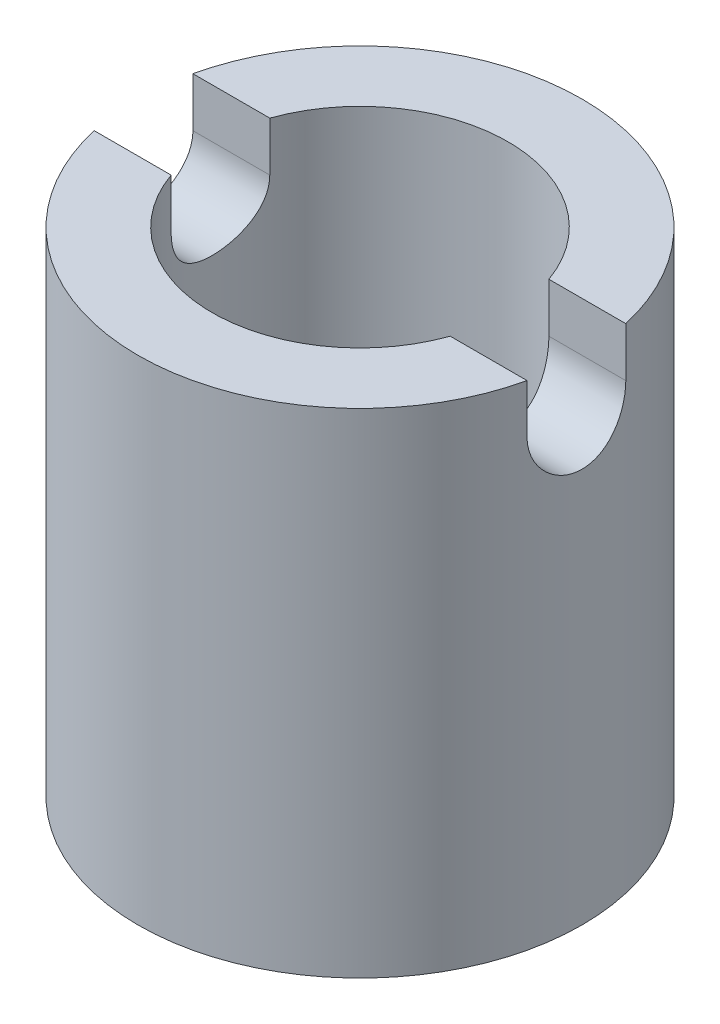
ISO-10303-21;
HEADER;
FILE_DESCRIPTION(('STEP AP214'),'2;1');
FILE_NAME('part.step','',(''),(''),'','','');
FILE_SCHEMA(('AUTOMOTIVE_DESIGN { 1 0 10303 214 1 1 1 1 }'));
ENDSEC;
DATA;
#1=APPLICATION_CONTEXT('core data for automotive mechanical design processes');
#2=APPLICATION_PROTOCOL_DEFINITION('international standard','automotive_design',2000,#1);
#3=PRODUCT_CONTEXT('',#1,'mechanical');
#4=PRODUCT('Part','Part','',(#3));
#5=PRODUCT_RELATED_PRODUCT_CATEGORY('part','',(#4));
#6=PRODUCT_DEFINITION_FORMATION('','',#4);
#7=PRODUCT_DEFINITION_CONTEXT('part definition',#1,'design');
#8=PRODUCT_DEFINITION('design','',#6,#7);
#9=PRODUCT_DEFINITION_SHAPE('','',#8);
#10=(LENGTH_UNIT() NAMED_UNIT(*) SI_UNIT(.MILLI.,.METRE.));
#11=(NAMED_UNIT(*) PLANE_ANGLE_UNIT() SI_UNIT($,.RADIAN.));
#12=(NAMED_UNIT(*) SI_UNIT($,.STERADIAN.) SOLID_ANGLE_UNIT());
#13=UNCERTAINTY_MEASURE_WITH_UNIT(LENGTH_MEASURE(1.E-05),#10,'distance_accuracy_value','');
#14=(GEOMETRIC_REPRESENTATION_CONTEXT(3) GLOBAL_UNCERTAINTY_ASSIGNED_CONTEXT((#13)) GLOBAL_UNIT_ASSIGNED_CONTEXT((#10,
#11,#12)) REPRESENTATION_CONTEXT('',''));
#15=CARTESIAN_POINT('',(0.,0.,0.));
#16=DIRECTION('',(0.,0.,1.));
#17=DIRECTION('',(1.,0.,0.));
#18=AXIS2_PLACEMENT_3D('',#15,#16,#17);
#19=CARTESIAN_POINT('',(0.,0.,0.));
#20=DIRECTION('',(0.,1.,0.));
#21=DIRECTION('',(0.,0.,1.));
#22=AXIS2_PLACEMENT_3D('',#19,#20,#21);
#23=PLANE('',#22);
#24=CARTESIAN_POINT('',(0.,0.,0.));
#25=DIRECTION('',(0.,1.,0.));
#26=DIRECTION('',(0.,0.,1.));
#27=AXIS2_PLACEMENT_3D('',#24,#25,#26);
#28=CIRCLE('',#27,4.5);
#29=CARTESIAN_POINT('',(0.,0.,4.5));
#30=VERTEX_POINT('',#29);
#31=EDGE_CURVE('E219',#30,#30,#28,.T.);
#32=ORIENTED_EDGE('',*,*,#31,.F.);
#33=EDGE_LOOP('',(#32));
#34=FACE_BOUND('',#33,.T.);
#35=CARTESIAN_POINT('',(0.,0.,0.));
#36=DIRECTION('',(0.,1.,0.));
#37=DIRECTION('',(0.,0.,1.));
#38=AXIS2_PLACEMENT_3D('',#35,#36,#37);
#39=CIRCLE('',#38,3.);
#40=CARTESIAN_POINT('',(0.,0.,3.));
#41=VERTEX_POINT('',#40);
#42=EDGE_CURVE('E222',#41,#41,#39,.T.);
#43=ORIENTED_EDGE('',*,*,#42,.T.);
#44=EDGE_LOOP('',(#43));
#45=FACE_BOUND('',#44,.T.);
#46=ADVANCED_FACE('F45',(#34,#45),#23,.F.);
#47=CARTESIAN_POINT('',(0.,9.,0.));
#48=DIRECTION('',(0.,-1.,0.));
#49=DIRECTION('',(0.,0.,-1.));
#50=AXIS2_PLACEMENT_3D('',#47,#48,#49);
#51=CYLINDRICAL_SURFACE('',#50,4.5);
#52=CARTESIAN_POINT('',(-4.38748219369606,9.,0.999999999999999));
#53=CARTESIAN_POINT('',(-4.38748057820017,8.9722374267632,1.00000022729756));
#54=CARTESIAN_POINT('',(-4.38774603792456,8.94448850762744,0.998843124720514));
#55=CARTESIAN_POINT('',(-4.38879432652499,8.88919622910976,0.99422968705631));
#56=CARTESIAN_POINT('',(-4.38957708187657,8.86165284107774,0.990773678717656));
#57=CARTESIAN_POINT('',(-4.39267087860999,8.77972846796468,0.977003810088015));
#58=CARTESIAN_POINT('',(-4.39572762287051,8.72590731765073,0.963287918104315));
#59=CARTESIAN_POINT('',(-4.40347693098967,8.62140532903998,0.927214454041531));
#60=CARTESIAN_POINT('',(-4.40816953687928,8.57072457147022,0.904856659920317));
#61=CARTESIAN_POINT('',(-4.41865929364095,8.47381365335537,0.852155803282729));
#62=CARTESIAN_POINT('',(-4.42445663511658,8.42758426289377,0.821811362459797));
#63=CARTESIAN_POINT('',(-4.43661426749371,8.34010972441778,0.753441836232103));
#64=CARTESIAN_POINT('',(-4.44298190226389,8.29895312248351,0.715304798206197));
#65=CARTESIAN_POINT('',(-4.45549904324729,8.22356146692631,0.632670298583491));
#66=CARTESIAN_POINT('',(-4.46164851515654,8.18932749787694,0.588171842200235));
#67=CARTESIAN_POINT('',(-4.47311661459631,8.12840376829879,0.493480718999463));
#68=CARTESIAN_POINT('',(-4.47842549507079,8.10179996527322,0.443231466972285));
#69=CARTESIAN_POINT('',(-4.48753032196369,8.05744917950465,0.338840325996899));
#70=CARTESIAN_POINT('',(-4.49132652279754,8.03970070726941,0.284699093445024));
#71=CARTESIAN_POINT('',(-4.49692639035223,8.01384342708513,0.174986021353865));
#72=CARTESIAN_POINT('',(-4.49876123301171,8.00558363249991,0.119451384668944));
#73=CARTESIAN_POINT('',(-4.50033975027167,7.99846584026957,0.0077551127497743));
#74=CARTESIAN_POINT('',(-4.50008362385938,7.99960694798699,-0.0484064623138756));
#75=CARTESIAN_POINT('',(-4.49753274170445,8.01114688291884,-0.158718181022163));
#76=CARTESIAN_POINT('',(-4.49527387966133,8.02138271828657,-0.212886328087552));
#77=CARTESIAN_POINT('',(-4.48901235449708,8.05056148976137,-0.318715838159107));
#78=CARTESIAN_POINT('',(-4.48500962486109,8.06950475799012,-0.370377105463959));
#79=CARTESIAN_POINT('',(-4.4756526258873,8.11570380281411,-0.470177597220577));
#80=CARTESIAN_POINT('',(-4.47028840892171,8.14302108290712,-0.518287379800329));
#81=CARTESIAN_POINT('',(-4.45879618403283,8.2051460967624,-0.609297798291436));
#82=CARTESIAN_POINT('',(-4.4526680906951,8.23995466849596,-0.6521978506051));
#83=CARTESIAN_POINT('',(-4.44016659933762,8.31695512505233,-0.732537514994334));
#84=CARTESIAN_POINT('',(-4.43379075752742,8.35928882796946,-0.76984092892418));
#85=CARTESIAN_POINT('',(-4.42163303741232,8.44969035552322,-0.836854255104537));
#86=CARTESIAN_POINT('',(-4.41585132197676,8.49775974473452,-0.866562088463181));
#87=CARTESIAN_POINT('',(-4.40552868647316,8.59850064694763,-0.917605722038659));
#88=CARTESIAN_POINT('',(-4.40099241682023,8.65118846461715,-0.938910270762524));
#89=CARTESIAN_POINT('',(-4.39373905796516,8.75948840213228,-0.972293085974256));
#90=CARTESIAN_POINT('',(-4.39101925996542,8.81509603364802,-0.984385094390383));
#91=CARTESIAN_POINT('',(-4.38874305217374,8.89263686833711,-0.994454316918766));
#92=CARTESIAN_POINT('',(-4.38827083327373,8.91407243613606,-0.996534530294845));
#93=CARTESIAN_POINT('',(-4.38764061776731,8.95700204078175,-0.999305697460969));
#94=CARTESIAN_POINT('',(-4.38748210050975,8.97849592135961,-0.999998953207969));
#95=CARTESIAN_POINT('',(-4.38748219369606,9.,-0.999999999999999));
#96=B_SPLINE_CURVE_WITH_KNOTS('',3,(#52,#53,#54,#55,#56,#57,#58,#59,#60,#61,#62,#63,#64,#65,#66,
#67,#68,#69,#70,#71,#72,#73,#74,#75,#76,#77,#78,#79,#80,#81,#82,#83,#84,#85,#86,#87,#88,#89,#90,
#91,#92,#93,#94,#95),.UNSPECIFIED.,.F.,.F.,(4,2,2,2,2,2,2,2,2,2,2,2,2,2,2,2,2,2,2,2,2,4),(0.,
0.0832354312787236,0.1664590346507,0.332474058250128,0.498493347667373,0.664541306899725,
0.833167762015411,1.00182061551778,1.17230483262337,1.34276036411496,1.51046425594233,
1.67815218840285,1.8428941784505,2.00764245266122,2.17363096141649,2.33963804720395,
2.50919081696053,2.67878994333886,2.8490139860664,3.01898361347143,3.08357107270779,
3.14805124582346),.UNSPECIFIED.);
#97=CARTESIAN_POINT('',(-4.38748219369606,9.,0.999999999999999));
#98=VERTEX_POINT('',#97);
#99=CARTESIAN_POINT('',(-4.38748219369606,9.,-1.));
#100=VERTEX_POINT('',#99);
#101=EDGE_CURVE('E185',#98,#100,#96,.T.);
#102=ORIENTED_EDGE('',*,*,#101,.T.);
#103=DIRECTION('',(0.,-1.,0.));
#104=VECTOR('',#103,1.);
#105=CARTESIAN_POINT('',(-4.38748219369606,10.,-1.));
#106=LINE('',#105,#104);
#107=CARTESIAN_POINT('',(-4.38748219369606,10.,-1.));
#108=VERTEX_POINT('',#107);
#109=EDGE_CURVE('E165',#108,#100,#106,.T.);
#110=ORIENTED_EDGE('',*,*,#109,.F.);
#111=CARTESIAN_POINT('',(0.,10.,0.));
#112=DIRECTION('',(0.,1.,0.));
#113=DIRECTION('',(0.,0.,1.));
#114=AXIS2_PLACEMENT_3D('',#111,#112,#113);
#115=CIRCLE('',#114,4.5);
#116=CARTESIAN_POINT('',(4.38748219369606,10.,-0.999999999999999));
#117=VERTEX_POINT('',#116);
#118=EDGE_CURVE('E174',#117,#108,#115,.T.);
#119=ORIENTED_EDGE('',*,*,#118,.F.);
#120=DIRECTION('',(0.,-1.,0.));
#121=VECTOR('',#120,1.);
#122=CARTESIAN_POINT('',(4.38748219369606,10.,-0.999999999999999));
#123=LINE('',#122,#121);
#124=CARTESIAN_POINT('',(4.38748219369606,9.,-0.999999999999999));
#125=VERTEX_POINT('',#124);
#126=EDGE_CURVE('E161',#117,#125,#123,.T.);
#127=ORIENTED_EDGE('',*,*,#126,.T.);
#128=CARTESIAN_POINT('',(4.38748219369606,9.,-0.999999999999999));
#129=CARTESIAN_POINT('',(4.38748057820017,8.9722374267632,-1.00000022729756));
#130=CARTESIAN_POINT('',(4.38774603792456,8.94448850762744,-0.998843124720514));
#131=CARTESIAN_POINT('',(4.38879432652499,8.88919622910976,-0.99422968705631));
#132=CARTESIAN_POINT('',(4.38957708187657,8.86165284107774,-0.990773678717656));
#133=CARTESIAN_POINT('',(4.39267087860999,8.77972846796468,-0.977003810088015));
#134=CARTESIAN_POINT('',(4.39572762287051,8.72590731765073,-0.963287918104315));
#135=CARTESIAN_POINT('',(4.40347693098967,8.62140532903998,-0.927214454041531));
#136=CARTESIAN_POINT('',(4.40816953687928,8.57072457147022,-0.904856659920317));
#137=CARTESIAN_POINT('',(4.41865929364095,8.47381365335537,-0.852155803282729));
#138=CARTESIAN_POINT('',(4.42445663511658,8.42758426289377,-0.821811362459797));
#139=CARTESIAN_POINT('',(4.43661426749371,8.34010972441778,-0.753441836232103));
#140=CARTESIAN_POINT('',(4.44298190226389,8.29895312248351,-0.715304798206197));
#141=CARTESIAN_POINT('',(4.45549904324729,8.22356146692631,-0.632670298583491));
#142=CARTESIAN_POINT('',(4.46164851515654,8.18932749787694,-0.588171842200235));
#143=CARTESIAN_POINT('',(4.47311661459631,8.12840376829879,-0.493480718999463));
#144=CARTESIAN_POINT('',(4.47842549507079,8.10179996527322,-0.443231466972285));
#145=CARTESIAN_POINT('',(4.48753032196369,8.05744917950465,-0.338840325996899));
#146=CARTESIAN_POINT('',(4.49132652279754,8.03970070726941,-0.284699093445024));
#147=CARTESIAN_POINT('',(4.49692639035223,8.01384342708513,-0.174986021353865));
#148=CARTESIAN_POINT('',(4.49876123301171,8.00558363249991,-0.119451384668944));
#149=CARTESIAN_POINT('',(4.50033975027167,7.99846584026957,-0.0077551127497743));
#150=CARTESIAN_POINT('',(4.50008362385938,7.99960694798699,0.0484064623138756));
#151=CARTESIAN_POINT('',(4.49753274170445,8.01114688291884,0.158718181022163));
#152=CARTESIAN_POINT('',(4.49527387966133,8.02138271828657,0.212886328087552));
#153=CARTESIAN_POINT('',(4.48901235449708,8.05056148976137,0.318715838159107));
#154=CARTESIAN_POINT('',(4.48500962486109,8.06950475799012,0.370377105463959));
#155=CARTESIAN_POINT('',(4.4756526258873,8.11570380281411,0.470177597220577));
#156=CARTESIAN_POINT('',(4.47028840892171,8.14302108290712,0.518287379800329));
#157=CARTESIAN_POINT('',(4.45879618403283,8.2051460967624,0.609297798291436));
#158=CARTESIAN_POINT('',(4.4526680906951,8.23995466849596,0.6521978506051));
#159=CARTESIAN_POINT('',(4.44016659933762,8.31695512505233,0.732537514994334));
#160=CARTESIAN_POINT('',(4.43379075752742,8.35928882796946,0.76984092892418));
#161=CARTESIAN_POINT('',(4.42163303741232,8.44969035552322,0.836854255104537));
#162=CARTESIAN_POINT('',(4.41585132197676,8.49775974473452,0.866562088463181));
#163=CARTESIAN_POINT('',(4.40552868647316,8.59850064694763,0.917605722038659));
#164=CARTESIAN_POINT('',(4.40099241682023,8.65118846461715,0.938910270762524));
#165=CARTESIAN_POINT('',(4.39373905796516,8.75948840213228,0.972293085974256));
#166=CARTESIAN_POINT('',(4.39101925996542,8.81509603364802,0.984385094390383));
#167=CARTESIAN_POINT('',(4.38874305217374,8.89263686833711,0.994454316918766));
#168=CARTESIAN_POINT('',(4.38827083327373,8.91407243613606,0.996534530294845));
#169=CARTESIAN_POINT('',(4.38764061776731,8.95700204078175,0.999305697460969));
#170=CARTESIAN_POINT('',(4.38748210050975,8.97849592135961,0.999998953207969));
#171=CARTESIAN_POINT('',(4.38748219369606,9.,0.999999999999999));
#172=B_SPLINE_CURVE_WITH_KNOTS('',3,(#128,#129,#130,#131,#132,#133,#134,#135,#136,#137,#138,
#139,#140,#141,#142,#143,#144,#145,#146,#147,#148,#149,#150,#151,#152,#153,#154,#155,#156,#157,
#158,#159,#160,#161,#162,#163,#164,#165,#166,#167,#168,#169,#170,#171),.UNSPECIFIED.,.F.,.F.,(4,
2,2,2,2,2,2,2,2,2,2,2,2,2,2,2,2,2,2,2,2,4),(0.,0.0832354312787236,0.1664590346507,
0.332474058250128,0.498493347667373,0.664541306899725,0.833167762015411,1.00182061551778,
1.17230483262337,1.34276036411496,1.51046425594233,1.67815218840285,1.8428941784505,
2.00764245266122,2.17363096141649,2.33963804720395,2.50919081696053,2.67878994333886,
2.8490139860664,3.01898361347143,3.08357107270779,3.14805124582346),.UNSPECIFIED.);
#173=CARTESIAN_POINT('',(4.38748219369606,9.,0.999999999999999));
#174=VERTEX_POINT('',#173);
#175=EDGE_CURVE('E194',#125,#174,#172,.T.);
#176=ORIENTED_EDGE('',*,*,#175,.T.);
#177=DIRECTION('',(0.,-1.,0.));
#178=VECTOR('',#177,1.);
#179=CARTESIAN_POINT('',(4.38748219369606,10.,0.999999999999997));
#180=LINE('',#179,#178);
#181=CARTESIAN_POINT('',(4.38748219369606,10.,0.999999999999997));
#182=VERTEX_POINT('',#181);
#183=EDGE_CURVE('E76',#182,#174,#180,.T.);
#184=ORIENTED_EDGE('',*,*,#183,.F.);
#185=CARTESIAN_POINT('',(0.,10.,0.));
#186=DIRECTION('',(0.,1.,0.));
#187=DIRECTION('',(0.,0.,1.));
#188=AXIS2_PLACEMENT_3D('',#185,#186,#187);
#189=CIRCLE('',#188,4.5);
#190=CARTESIAN_POINT('',(-4.38748219369606,10.,0.999999999999999));
#191=VERTEX_POINT('',#190);
#192=EDGE_CURVE('E129',#191,#182,#189,.T.);
#193=ORIENTED_EDGE('',*,*,#192,.F.);
#194=DIRECTION('',(0.,-1.,0.));
#195=VECTOR('',#194,1.);
#196=CARTESIAN_POINT('',(-4.38748219369606,10.,0.999999999999999));
#197=LINE('',#196,#195);
#198=EDGE_CURVE('E125',#191,#98,#197,.T.);
#199=ORIENTED_EDGE('',*,*,#198,.T.);
#200=EDGE_LOOP('',(#102,#110,#119,#127,#176,#184,#193,#199));
#201=FACE_BOUND('',#200,.T.);
#202=ORIENTED_EDGE('',*,*,#31,.T.);
#203=EDGE_LOOP('',(#202));
#204=FACE_BOUND('',#203,.T.);
#205=ADVANCED_FACE('F47',(#201,#204),#51,.T.);
#206=CARTESIAN_POINT('',(0.,9.,0.));
#207=DIRECTION('',(0.,-1.,0.));
#208=DIRECTION('',(0.,0.,-1.));
#209=AXIS2_PLACEMENT_3D('',#206,#207,#208);
#210=CYLINDRICAL_SURFACE('',#209,3.);
#211=CARTESIAN_POINT('',(2.82842712474619,9.,-0.999999999999999));
#212=CARTESIAN_POINT('',(2.82842442094339,8.97270950319888,-1.0000007474592));
#213=CARTESIAN_POINT('',(2.82882259943245,8.94543293781067,-0.998882124587391));
#214=CARTESIAN_POINT('',(2.83039327289221,8.8910914159451,-0.9944256070364));
#215=CARTESIAN_POINT('',(2.83156555884122,8.8640264043403,-0.991088311433523));
#216=CARTESIAN_POINT('',(2.83619092224651,8.78360785680486,-0.977810675230787));
#217=CARTESIAN_POINT('',(2.84075292499515,8.73081915372952,-0.964604233028112));
#218=CARTESIAN_POINT('',(2.85228074698859,8.62837480755622,-0.929958411830427));
#219=CARTESIAN_POINT('',(2.85924523952929,8.57871745312708,-0.908523575987532));
#220=CARTESIAN_POINT('',(2.87478787219461,8.48366016599454,-0.858073228964868));
#221=CARTESIAN_POINT('',(2.88336700228108,8.43826287093265,-0.829053062822734));
#222=CARTESIAN_POINT('',(2.90154480402048,8.35127976867547,-0.763051393523011));
#223=CARTESIAN_POINT('',(2.91116877768309,8.30988511953739,-0.725824980322035));
#224=CARTESIAN_POINT('',(2.93013848692978,8.2337939822083,-0.644988442991481));
#225=CARTESIAN_POINT('',(2.93948417271853,8.19909868674406,-0.601377184554535));
#226=CARTESIAN_POINT('',(2.95713882994227,8.1365204811958,-0.507603645956263));
#227=CARTESIAN_POINT('',(2.96541437561854,8.10883901559775,-0.457300089358495));
#228=CARTESIAN_POINT('',(2.97969608604658,8.06240774831273,-0.352429249965858));
#229=CARTESIAN_POINT('',(2.9857029439331,8.04365521817956,-0.297863275593419));
#230=CARTESIAN_POINT('',(2.99459071142923,8.01626427390863,-0.188029345478036));
#231=CARTESIAN_POINT('',(2.99757308988573,8.00729672744632,-0.132851834460111));
#232=CARTESIAN_POINT('',(3.00043608403817,7.99868370147439,-0.0216989694556717));
#233=CARTESIAN_POINT('',(3.00031743881302,7.99903600073025,0.0342761912453937));
#234=CARTESIAN_POINT('',(2.99706038635266,8.00884428310665,0.143103845279393));
#235=CARTESIAN_POINT('',(2.99404060991264,8.01794263795946,0.195992702625537));
#236=CARTESIAN_POINT('',(2.98546960500824,8.04439319867412,0.299444064376657));
#237=CARTESIAN_POINT('',(2.97991823617731,8.06174586220625,0.350006439616465));
#238=CARTESIAN_POINT('',(2.96675668271304,8.10442136960063,0.448152623030963));
#239=CARTESIAN_POINT('',(2.95912037838313,8.12984604512234,0.495688505653993));
#240=CARTESIAN_POINT('',(2.94258387680044,8.1878599513907,0.585924589097489));
#241=CARTESIAN_POINT('',(2.93368333597593,8.22045113104652,0.628623469714685));
#242=CARTESIAN_POINT('',(2.9150627194274,8.29367104999684,0.710097339711213));
#243=CARTESIAN_POINT('',(2.90532378679914,8.33460554360971,0.748593611612699));
#244=CARTESIAN_POINT('',(2.88647490472851,8.42244148971617,0.818272024820384));
#245=CARTESIAN_POINT('',(2.87736515915753,8.46934486240324,0.849451803183813));
#246=CARTESIAN_POINT('',(2.86070031376318,8.56868017835328,0.904003325592783));
#247=CARTESIAN_POINT('',(2.85317014948235,8.62118351493294,0.927253009507682));
#248=CARTESIAN_POINT('',(2.84081097062039,8.72964697758995,0.964460230701116));
#249=CARTESIAN_POINT('',(2.83597769408993,8.78560149337215,0.978432436055356));
#250=CARTESIAN_POINT('',(2.8313654209472,8.86841863674798,0.991658156280828));
#251=CARTESIAN_POINT('',(2.83026667694602,8.89464138985423,0.994785061255115));
#252=CARTESIAN_POINT('',(2.82879703571399,8.94723807839981,0.998954616071196));
#253=CARTESIAN_POINT('',(2.82842519929528,8.9736117745444,0.999999955394977));
#254=CARTESIAN_POINT('',(2.82842712474619,9.,0.999999999999999));
#255=B_SPLINE_CURVE_WITH_KNOTS('',3,(#211,#212,#213,#214,#215,#216,#217,#218,#219,#220,#221,
#222,#223,#224,#225,#226,#227,#228,#229,#230,#231,#232,#233,#234,#235,#236,#237,#238,#239,#240,
#241,#242,#243,#244,#245,#246,#247,#248,#249,#250,#251,#252,#253,#254),.UNSPECIFIED.,.F.,.F.,(4,
2,2,2,2,2,2,2,2,2,2,2,2,2,2,2,2,2,2,2,2,4),(0.,0.0818184847354335,0.163614886169463,
0.326581198395373,0.489457660966237,0.65243431313531,0.821165049626776,0.989925798637473,
1.16309132933101,1.33620391121127,1.50329470727403,1.67034568030642,1.83084418465735,
1.99135158908248,2.15397018825968,2.31663306588768,2.4869405405805,2.65730294249242,
2.8301802992804,3.00278367486839,3.08199895332751,3.16111181529056),.UNSPECIFIED.);
#256=CARTESIAN_POINT('',(2.82842712474619,9.,-0.999999999999999));
#257=VERTEX_POINT('',#256);
#258=CARTESIAN_POINT('',(2.82842712474619,9.,0.999999999999999));
#259=VERTEX_POINT('',#258);
#260=EDGE_CURVE('E11',#257,#259,#255,.T.);
#261=ORIENTED_EDGE('',*,*,#260,.F.);
#262=DIRECTION('',(0.,-1.,0.));
#263=VECTOR('',#262,1.);
#264=CARTESIAN_POINT('',(2.82842712474619,10.,-0.999999999999999));
#265=LINE('',#264,#263);
#266=CARTESIAN_POINT('',(2.82842712474619,10.,-0.999999999999999));
#267=VERTEX_POINT('',#266);
#268=EDGE_CURVE('E68',#267,#257,#265,.T.);
#269=ORIENTED_EDGE('',*,*,#268,.F.);
#270=CARTESIAN_POINT('',(0.,10.,0.));
#271=DIRECTION('',(0.,-1.,0.));
#272=DIRECTION('',(0.,0.,1.));
#273=AXIS2_PLACEMENT_3D('',#270,#271,#272);
#274=CIRCLE('',#273,3.);
#275=CARTESIAN_POINT('',(-2.82842712474619,10.,-0.999999999999999));
#276=VERTEX_POINT('',#275);
#277=EDGE_CURVE('E139',#276,#267,#274,.T.);
#278=ORIENTED_EDGE('',*,*,#277,.F.);
#279=DIRECTION('',(0.,-1.,0.));
#280=VECTOR('',#279,1.);
#281=CARTESIAN_POINT('',(-2.82842712474619,10.,-0.999999999999999));
#282=LINE('',#281,#280);
#283=CARTESIAN_POINT('',(-2.82842712474619,9.,-0.999999999999999));
#284=VERTEX_POINT('',#283);
#285=EDGE_CURVE('E168',#276,#284,#282,.T.);
#286=ORIENTED_EDGE('',*,*,#285,.T.);
#287=CARTESIAN_POINT('',(-2.82842712474619,9.,0.999999999999999));
#288=CARTESIAN_POINT('',(-2.82842442094339,8.97270950319888,1.0000007474592));
#289=CARTESIAN_POINT('',(-2.82882259943245,8.94543293781067,0.998882124587391));
#290=CARTESIAN_POINT('',(-2.83039327289221,8.8910914159451,0.9944256070364));
#291=CARTESIAN_POINT('',(-2.83156555884122,8.8640264043403,0.991088311433523));
#292=CARTESIAN_POINT('',(-2.83619092224651,8.78360785680486,0.977810675230787));
#293=CARTESIAN_POINT('',(-2.84075292499515,8.73081915372952,0.964604233028112));
#294=CARTESIAN_POINT('',(-2.85228074698859,8.62837480755622,0.929958411830427));
#295=CARTESIAN_POINT('',(-2.85924523952929,8.57871745312708,0.908523575987532));
#296=CARTESIAN_POINT('',(-2.87478787219461,8.48366016599454,0.858073228964868));
#297=CARTESIAN_POINT('',(-2.88336700228108,8.43826287093265,0.829053062822734));
#298=CARTESIAN_POINT('',(-2.90154480402048,8.35127976867547,0.763051393523011));
#299=CARTESIAN_POINT('',(-2.91116877768309,8.30988511953739,0.725824980322035));
#300=CARTESIAN_POINT('',(-2.93013848692978,8.2337939822083,0.644988442991481));
#301=CARTESIAN_POINT('',(-2.93948417271853,8.19909868674406,0.601377184554535));
#302=CARTESIAN_POINT('',(-2.95713882994227,8.1365204811958,0.507603645956263));
#303=CARTESIAN_POINT('',(-2.96541437561854,8.10883901559775,0.457300089358495));
#304=CARTESIAN_POINT('',(-2.97969608604658,8.06240774831273,0.352429249965858));
#305=CARTESIAN_POINT('',(-2.9857029439331,8.04365521817956,0.297863275593419));
#306=CARTESIAN_POINT('',(-2.99459071142923,8.01626427390863,0.188029345478036));
#307=CARTESIAN_POINT('',(-2.99757308988573,8.00729672744632,0.132851834460111));
#308=CARTESIAN_POINT('',(-3.00043608403817,7.99868370147439,0.0216989694556717));
#309=CARTESIAN_POINT('',(-3.00031743881302,7.99903600073025,-0.0342761912453937));
#310=CARTESIAN_POINT('',(-2.99706038635266,8.00884428310665,-0.143103845279393));
#311=CARTESIAN_POINT('',(-2.99404060991264,8.01794263795946,-0.195992702625537));
#312=CARTESIAN_POINT('',(-2.98546960500824,8.04439319867412,-0.299444064376657));
#313=CARTESIAN_POINT('',(-2.97991823617731,8.06174586220625,-0.350006439616465));
#314=CARTESIAN_POINT('',(-2.96675668271304,8.10442136960063,-0.448152623030963));
#315=CARTESIAN_POINT('',(-2.95912037838313,8.12984604512234,-0.495688505653993));
#316=CARTESIAN_POINT('',(-2.94258387680044,8.1878599513907,-0.585924589097489));
#317=CARTESIAN_POINT('',(-2.93368333597593,8.22045113104652,-0.628623469714685));
#318=CARTESIAN_POINT('',(-2.9150627194274,8.29367104999684,-0.710097339711213));
#319=CARTESIAN_POINT('',(-2.90532378679914,8.33460554360971,-0.748593611612699));
#320=CARTESIAN_POINT('',(-2.88647490472851,8.42244148971617,-0.818272024820384));
#321=CARTESIAN_POINT('',(-2.87736515915753,8.46934486240324,-0.849451803183813));
#322=CARTESIAN_POINT('',(-2.86070031376318,8.56868017835328,-0.904003325592783));
#323=CARTESIAN_POINT('',(-2.85317014948235,8.62118351493294,-0.927253009507682));
#324=CARTESIAN_POINT('',(-2.84081097062039,8.72964697758995,-0.964460230701116));
#325=CARTESIAN_POINT('',(-2.83597769408993,8.78560149337215,-0.978432436055356));
#326=CARTESIAN_POINT('',(-2.8313654209472,8.86841863674798,-0.991658156280828));
#327=CARTESIAN_POINT('',(-2.83026667694602,8.89464138985423,-0.994785061255115));
#328=CARTESIAN_POINT('',(-2.82879703571399,8.94723807839981,-0.998954616071196));
#329=CARTESIAN_POINT('',(-2.82842519929528,8.9736117745444,-0.999999955394977));
#330=CARTESIAN_POINT('',(-2.82842712474619,9.,-0.999999999999999));
#331=B_SPLINE_CURVE_WITH_KNOTS('',3,(#287,#288,#289,#290,#291,#292,#293,#294,#295,#296,#297,
#298,#299,#300,#301,#302,#303,#304,#305,#306,#307,#308,#309,#310,#311,#312,#313,#314,#315,#316,
#317,#318,#319,#320,#321,#322,#323,#324,#325,#326,#327,#328,#329,#330),.UNSPECIFIED.,.F.,.F.,(4,
2,2,2,2,2,2,2,2,2,2,2,2,2,2,2,2,2,2,2,2,4),(0.,0.0818184847354335,0.163614886169463,
0.326581198395373,0.489457660966237,0.65243431313531,0.821165049626776,0.989925798637473,
1.16309132933101,1.33620391121127,1.50329470727403,1.67034568030642,1.83084418465735,
1.99135158908248,2.15397018825968,2.31663306588768,2.4869405405805,2.65730294249242,
2.8301802992804,3.00278367486839,3.08199895332751,3.16111181529056),.UNSPECIFIED.);
#332=CARTESIAN_POINT('',(-2.82842712474619,9.,0.999999999999999));
#333=VERTEX_POINT('',#332);
#334=EDGE_CURVE('E61',#333,#284,#331,.T.);
#335=ORIENTED_EDGE('',*,*,#334,.F.);
#336=DIRECTION('',(0.,-1.,0.));
#337=VECTOR('',#336,1.);
#338=CARTESIAN_POINT('',(-2.82842712474619,10.,0.999999999999999));
#339=LINE('',#338,#337);
#340=CARTESIAN_POINT('',(-2.82842712474619,10.,0.999999999999999));
#341=VERTEX_POINT('',#340);
#342=EDGE_CURVE('E122',#341,#333,#339,.T.);
#343=ORIENTED_EDGE('',*,*,#342,.F.);
#344=CARTESIAN_POINT('',(0.,10.,0.));
#345=DIRECTION('',(0.,-1.,0.));
#346=DIRECTION('',(0.,0.,1.));
#347=AXIS2_PLACEMENT_3D('',#344,#345,#346);
#348=CIRCLE('',#347,3.);
#349=CARTESIAN_POINT('',(2.82842712474619,10.,0.999999999999999));
#350=VERTEX_POINT('',#349);
#351=EDGE_CURVE('E130',#350,#341,#348,.T.);
#352=ORIENTED_EDGE('',*,*,#351,.F.);
#353=DIRECTION('',(0.,-1.,0.));
#354=VECTOR('',#353,1.);
#355=CARTESIAN_POINT('',(2.82842712474619,10.,0.999999999999999));
#356=LINE('',#355,#354);
#357=EDGE_CURVE('E235',#350,#259,#356,.T.);
#358=ORIENTED_EDGE('',*,*,#357,.T.);
#359=EDGE_LOOP('',(#261,#269,#278,#286,#335,#343,#352,#358));
#360=FACE_BOUND('',#359,.T.);
#361=ORIENTED_EDGE('',*,*,#42,.F.);
#362=EDGE_LOOP('',(#361));
#363=FACE_BOUND('',#362,.T.);
#364=ADVANCED_FACE('F143',(#360,#363),#210,.F.);
#365=CARTESIAN_POINT('',(-4.5,9.,0.));
#366=DIRECTION('',(1.,0.,0.));
#367=DIRECTION('',(0.,0.,-1.));
#368=AXIS2_PLACEMENT_3D('',#365,#366,#367);
#369=CYLINDRICAL_SURFACE('',#368,0.999999999999999);
#370=DIRECTION('',(1.,0.,0.));
#371=VECTOR('',#370,1.);
#372=CARTESIAN_POINT('',(-4.5,9.,0.999999999999999));
#373=LINE('',#372,#371);
#374=EDGE_CURVE('E153',#98,#333,#373,.T.);
#375=ORIENTED_EDGE('',*,*,#374,.T.);
#376=ORIENTED_EDGE('',*,*,#334,.T.);
#377=DIRECTION('',(1.,0.,0.));
#378=VECTOR('',#377,1.);
#379=CARTESIAN_POINT('',(-4.5,9.,-0.999999999999999));
#380=LINE('',#379,#378);
#381=EDGE_CURVE('E148',#284,#100,#380,.F.);
#382=ORIENTED_EDGE('',*,*,#381,.T.);
#383=ORIENTED_EDGE('',*,*,#101,.F.);
#384=EDGE_LOOP('',(#375,#376,#382,#383));
#385=FACE_BOUND('',#384,.T.);
#386=ADVANCED_FACE('F205',(#385),#369,.F.);
#387=EDGE_CURVE('E155',#125,#257,#380,.F.);
#388=ORIENTED_EDGE('',*,*,#387,.T.);
#389=ORIENTED_EDGE('',*,*,#260,.T.);
#390=EDGE_CURVE('E186',#259,#174,#373,.T.);
#391=ORIENTED_EDGE('',*,*,#390,.T.);
#392=ORIENTED_EDGE('',*,*,#175,.F.);
#393=EDGE_LOOP('',(#388,#389,#391,#392));
#394=FACE_BOUND('',#393,.T.);
#395=ADVANCED_FACE('F200',(#394),#369,.F.);
#396=CARTESIAN_POINT('',(2.82842712474619,10.,-0.999999999999999));
#397=DIRECTION('',(0.,0.,-1.));
#398=DIRECTION('',(-1.,0.,0.));
#399=AXIS2_PLACEMENT_3D('',#396,#397,#398);
#400=PLANE('',#399);
#401=ORIENTED_EDGE('',*,*,#387,.F.);
#402=ORIENTED_EDGE('',*,*,#126,.F.);
#403=DIRECTION('',(1.,0.,0.));
#404=VECTOR('',#403,1.);
#405=CARTESIAN_POINT('',(2.82842712474619,10.,-0.999999999999999));
#406=LINE('',#405,#404);
#407=EDGE_CURVE('E177',#267,#117,#406,.T.);
#408=ORIENTED_EDGE('',*,*,#407,.F.);
#409=ORIENTED_EDGE('',*,*,#268,.T.);
#410=EDGE_LOOP('',(#401,#402,#408,#409));
#411=FACE_BOUND('',#410,.T.);
#412=ADVANCED_FACE('F204',(#411),#400,.F.);
#413=CARTESIAN_POINT('',(-4.38748219369606,10.,-0.999999999999999));
#414=DIRECTION('',(0.,0.,-1.));
#415=DIRECTION('',(-1.,0.,0.));
#416=AXIS2_PLACEMENT_3D('',#413,#414,#415);
#417=PLANE('',#416);
#418=ORIENTED_EDGE('',*,*,#381,.F.);
#419=ORIENTED_EDGE('',*,*,#285,.F.);
#420=DIRECTION('',(1.,0.,0.));
#421=VECTOR('',#420,1.);
#422=CARTESIAN_POINT('',(-4.38748219369606,10.,-0.999999999999999));
#423=LINE('',#422,#421);
#424=EDGE_CURVE('E171',#108,#276,#423,.T.);
#425=ORIENTED_EDGE('',*,*,#424,.F.);
#426=ORIENTED_EDGE('',*,*,#109,.T.);
#427=EDGE_LOOP('',(#418,#419,#425,#426));
#428=FACE_BOUND('',#427,.T.);
#429=ADVANCED_FACE('F274',(#428),#417,.F.);
#430=CARTESIAN_POINT('',(0.,10.,0.));
#431=DIRECTION('',(0.,1.,0.));
#432=DIRECTION('',(0.,0.,1.));
#433=AXIS2_PLACEMENT_3D('',#430,#431,#432);
#434=PLANE('',#433);
#435=ORIENTED_EDGE('',*,*,#277,.T.);
#436=ORIENTED_EDGE('',*,*,#407,.T.);
#437=ORIENTED_EDGE('',*,*,#118,.T.);
#438=ORIENTED_EDGE('',*,*,#424,.T.);
#439=EDGE_LOOP('',(#435,#436,#437,#438));
#440=FACE_BOUND('',#439,.T.);
#441=ADVANCED_FACE('F207',(#440),#434,.T.);
#442=CARTESIAN_POINT('',(-2.82842712474619,10.,0.999999999999999));
#443=DIRECTION('',(0.,0.,1.));
#444=DIRECTION('',(1.,0.,0.));
#445=AXIS2_PLACEMENT_3D('',#442,#443,#444);
#446=PLANE('',#445);
#447=ORIENTED_EDGE('',*,*,#374,.F.);
#448=ORIENTED_EDGE('',*,*,#198,.F.);
#449=DIRECTION('',(-1.,0.,0.));
#450=VECTOR('',#449,1.);
#451=CARTESIAN_POINT('',(-2.82842712474619,10.,0.999999999999999));
#452=LINE('',#451,#450);
#453=EDGE_CURVE('E118',#341,#191,#452,.T.);
#454=ORIENTED_EDGE('',*,*,#453,.F.);
#455=ORIENTED_EDGE('',*,*,#342,.T.);
#456=EDGE_LOOP('',(#447,#448,#454,#455));
#457=FACE_BOUND('',#456,.T.);
#458=ADVANCED_FACE('F120',(#457),#446,.F.);
#459=CARTESIAN_POINT('',(4.38748219369606,10.,0.999999999999999));
#460=DIRECTION('',(0.,0.,1.));
#461=DIRECTION('',(1.,0.,0.));
#462=AXIS2_PLACEMENT_3D('',#459,#460,#461);
#463=PLANE('',#462);
#464=ORIENTED_EDGE('',*,*,#390,.F.);
#465=ORIENTED_EDGE('',*,*,#357,.F.);
#466=DIRECTION('',(-1.,0.,0.));
#467=VECTOR('',#466,1.);
#468=CARTESIAN_POINT('',(4.38748219369606,10.,0.999999999999999));
#469=LINE('',#468,#467);
#470=EDGE_CURVE('E134',#182,#350,#469,.T.);
#471=ORIENTED_EDGE('',*,*,#470,.F.);
#472=ORIENTED_EDGE('',*,*,#183,.T.);
#473=EDGE_LOOP('',(#464,#465,#471,#472));
#474=FACE_BOUND('',#473,.T.);
#475=ADVANCED_FACE('F244',(#474),#463,.F.);
#476=CARTESIAN_POINT('',(0.,10.,0.));
#477=DIRECTION('',(0.,1.,0.));
#478=DIRECTION('',(0.,0.,1.));
#479=AXIS2_PLACEMENT_3D('',#476,#477,#478);
#480=PLANE('',#479);
#481=ORIENTED_EDGE('',*,*,#351,.T.);
#482=ORIENTED_EDGE('',*,*,#453,.T.);
#483=ORIENTED_EDGE('',*,*,#192,.T.);
#484=ORIENTED_EDGE('',*,*,#470,.T.);
#485=EDGE_LOOP('',(#481,#482,#483,#484));
#486=FACE_BOUND('',#485,.T.);
#487=ADVANCED_FACE('F133',(#486),#480,.T.);
#488=CLOSED_SHELL('',(#46,#205,#364,#386,#395,#412,#429,#441,#458,#475,#487));
#489=MANIFOLD_SOLID_BREP('B2',#488);
#490=ADVANCED_BREP_SHAPE_REPRESENTATION('',(#18,#489),#14);
#491=SHAPE_DEFINITION_REPRESENTATION(#9,#490);
ENDSEC;
END-ISO-10303-21;
